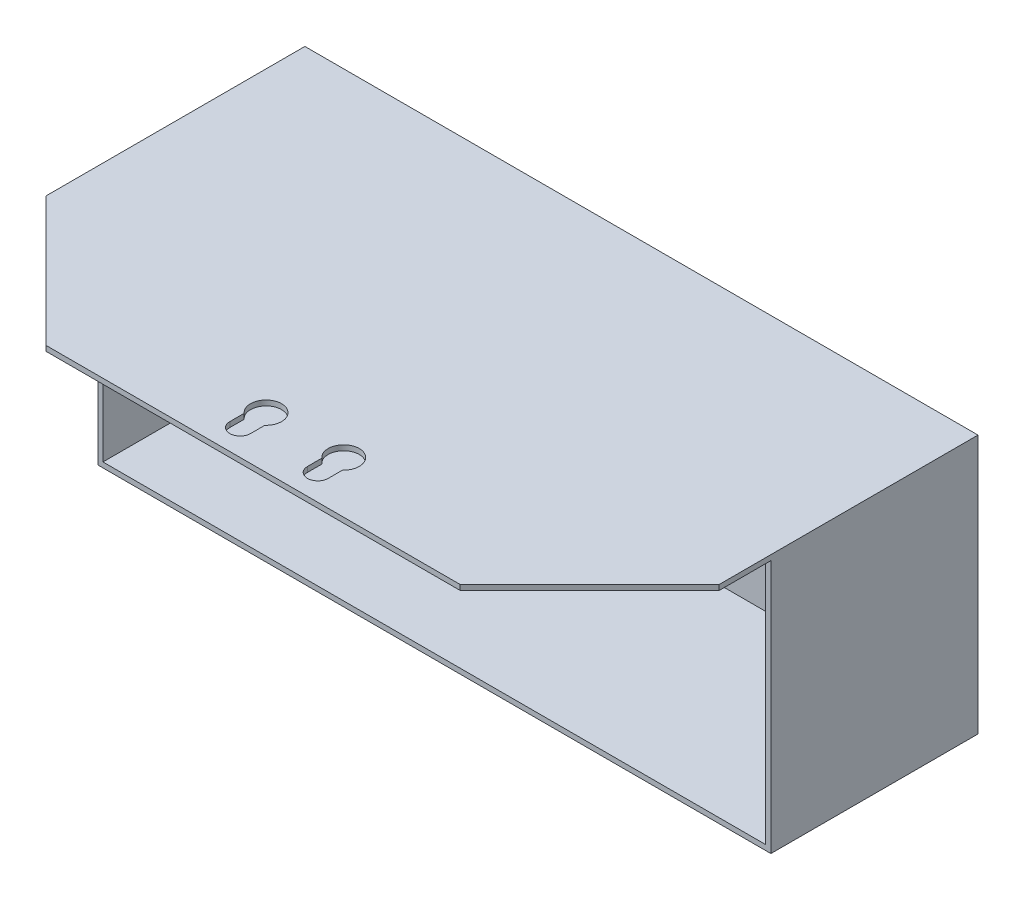
ISO-10303-21;
HEADER;
FILE_DESCRIPTION(('STEP AP214'),'2;1');
FILE_NAME('part.step','',(''),(''),'','','');
FILE_SCHEMA(('AUTOMOTIVE_DESIGN { 1 0 10303 214 1 1 1 1 }'));
ENDSEC;
DATA;
#1=APPLICATION_CONTEXT('core data for automotive mechanical design processes');
#2=APPLICATION_PROTOCOL_DEFINITION('international standard','automotive_design',2000,#1);
#3=PRODUCT_CONTEXT('',#1,'mechanical');
#4=PRODUCT('Part','Part','',(#3));
#5=PRODUCT_RELATED_PRODUCT_CATEGORY('part','',(#4));
#6=PRODUCT_DEFINITION_FORMATION('','',#4);
#7=PRODUCT_DEFINITION_CONTEXT('part definition',#1,'design');
#8=PRODUCT_DEFINITION('design','',#6,#7);
#9=PRODUCT_DEFINITION_SHAPE('','',#8);
#10=(LENGTH_UNIT() NAMED_UNIT(*) SI_UNIT(.MILLI.,.METRE.));
#11=(NAMED_UNIT(*) PLANE_ANGLE_UNIT() SI_UNIT($,.RADIAN.));
#12=(NAMED_UNIT(*) SI_UNIT($,.STERADIAN.) SOLID_ANGLE_UNIT());
#13=UNCERTAINTY_MEASURE_WITH_UNIT(LENGTH_MEASURE(1.E-05),#10,'distance_accuracy_value','');
#14=(GEOMETRIC_REPRESENTATION_CONTEXT(3) GLOBAL_UNCERTAINTY_ASSIGNED_CONTEXT((#13)) GLOBAL_UNIT_ASSIGNED_CONTEXT((#10,
#11,#12)) REPRESENTATION_CONTEXT('',''));
#15=CARTESIAN_POINT('',(0.,0.,0.));
#16=DIRECTION('',(0.,0.,1.));
#17=DIRECTION('',(1.,0.,0.));
#18=AXIS2_PLACEMENT_3D('',#15,#16,#17);
#19=CARTESIAN_POINT('',(0.,100.,79.9999999999999));
#20=DIRECTION('',(0.,0.,-0.999999999999999));
#21=DIRECTION('',(-1.,0.,0.));
#22=AXIS2_PLACEMENT_3D('',#19,#20,#21);
#23=PLANE('',#22);
#24=DIRECTION('',(0.,1.,0.));
#25=VECTOR('',#24,1.);
#26=CARTESIAN_POINT('',(260.,0.,79.9999999999999));
#27=LINE('',#26,#25);
#28=CARTESIAN_POINT('',(260.,0.,79.9999999999999));
#29=VERTEX_POINT('',#28);
#30=CARTESIAN_POINT('',(260.,97.9999999999999,79.9999999999999));
#31=VERTEX_POINT('',#30);
#32=EDGE_CURVE('E270',#29,#31,#27,.T.);
#33=ORIENTED_EDGE('',*,*,#32,.T.);
#34=DIRECTION('',(-1.,0.,0.));
#35=VECTOR('',#34,1.);
#36=CARTESIAN_POINT('',(0.,98.0000000000001,79.9999999999999));
#37=LINE('',#36,#35);
#38=CARTESIAN_POINT('',(258.,97.9999999999999,80.));
#39=VERTEX_POINT('',#38);
#40=EDGE_CURVE('E260',#31,#39,#37,.T.);
#41=ORIENTED_EDGE('',*,*,#40,.T.);
#42=DIRECTION('',(0.,1.,0.));
#43=VECTOR('',#42,1.);
#44=CARTESIAN_POINT('',(258.,100.,80.));
#45=LINE('',#44,#43);
#46=CARTESIAN_POINT('',(258.,2.,79.9999999999999));
#47=VERTEX_POINT('',#46);
#48=EDGE_CURVE('E282',#47,#39,#45,.T.);
#49=ORIENTED_EDGE('',*,*,#48,.F.);
#50=DIRECTION('',(1.,0.,0.));
#51=VECTOR('',#50,1.);
#52=CARTESIAN_POINT('',(0.,2.,79.9999999999999));
#53=LINE('',#52,#51);
#54=CARTESIAN_POINT('',(2.,2.,79.9999999999999));
#55=VERTEX_POINT('',#54);
#56=EDGE_CURVE('E287',#55,#47,#53,.T.);
#57=ORIENTED_EDGE('',*,*,#56,.F.);
#58=DIRECTION('',(0.,-1.,0.));
#59=VECTOR('',#58,1.);
#60=CARTESIAN_POINT('',(2.,100.,79.9999999999999));
#61=LINE('',#60,#59);
#62=CARTESIAN_POINT('',(2.,98.0000000000001,79.9999999999999));
#63=VERTEX_POINT('',#62);
#64=EDGE_CURVE('E285',#63,#55,#61,.T.);
#65=ORIENTED_EDGE('',*,*,#64,.F.);
#66=CARTESIAN_POINT('',(0.,98.0000000000001,79.9999999999999));
#67=VERTEX_POINT('',#66);
#68=EDGE_CURVE('E264',#63,#67,#37,.T.);
#69=ORIENTED_EDGE('',*,*,#68,.T.);
#70=DIRECTION('',(0.,-1.,0.));
#71=VECTOR('',#70,1.);
#72=CARTESIAN_POINT('',(0.,0.,79.9999999999999));
#73=LINE('',#72,#71);
#74=CARTESIAN_POINT('',(0.,0.,79.9999999999999));
#75=VERTEX_POINT('',#74);
#76=EDGE_CURVE('E340',#67,#75,#73,.T.);
#77=ORIENTED_EDGE('',*,*,#76,.T.);
#78=DIRECTION('',(1.,0.,0.));
#79=VECTOR('',#78,1.);
#80=CARTESIAN_POINT('',(0.,0.,79.9999999999999));
#81=LINE('',#80,#79);
#82=EDGE_CURVE('E342',#75,#29,#81,.T.);
#83=ORIENTED_EDGE('',*,*,#82,.T.);
#84=EDGE_LOOP('',(#33,#41,#49,#57,#65,#69,#77,#83));
#85=FACE_BOUND('',#84,.T.);
#86=ADVANCED_FACE('F36',(#85),#23,.F.);
#87=CARTESIAN_POINT('',(0.,0.,79.9999999999999));
#88=DIRECTION('',(1.,0.,0.));
#89=DIRECTION('',(0.,0.,-0.999999999999999));
#90=AXIS2_PLACEMENT_3D('',#87,#88,#89);
#91=PLANE('',#90);
#92=DIRECTION('',(0.,0.,0.999999999999999));
#93=VECTOR('',#92,1.);
#94=CARTESIAN_POINT('',(0.,98.0000000000001,79.9999999999999));
#95=LINE('',#94,#93);
#96=CARTESIAN_POINT('',(0.,98.0000000000001,99.9999999999999));
#97=VERTEX_POINT('',#96);
#98=EDGE_CURVE('E273',#67,#97,#95,.T.);
#99=ORIENTED_EDGE('',*,*,#98,.T.);
#100=DIRECTION('',(0.,1.,0.));
#101=VECTOR('',#100,1.);
#102=CARTESIAN_POINT('',(0.,100.,99.9999999999999));
#103=LINE('',#102,#101);
#104=CARTESIAN_POINT('',(0.,100.,99.9999999999999));
#105=VERTEX_POINT('',#104);
#106=EDGE_CURVE('E11',#97,#105,#103,.T.);
#107=ORIENTED_EDGE('',*,*,#106,.T.);
#108=DIRECTION('',(0.,0.,-0.999999999999999));
#109=VECTOR('',#108,1.);
#110=CARTESIAN_POINT('',(0.,100.,79.9999999999999));
#111=LINE('',#110,#109);
#112=CARTESIAN_POINT('',(0.,100.,0.));
#113=VERTEX_POINT('',#112);
#114=EDGE_CURVE('E333',#105,#113,#111,.T.);
#115=ORIENTED_EDGE('',*,*,#114,.T.);
#116=DIRECTION('',(0.,-1.,0.));
#117=VECTOR('',#116,1.);
#118=CARTESIAN_POINT('',(0.,0.,0.));
#119=LINE('',#118,#117);
#120=CARTESIAN_POINT('',(0.,0.,0.));
#121=VERTEX_POINT('',#120);
#122=EDGE_CURVE('E350',#113,#121,#119,.T.);
#123=ORIENTED_EDGE('',*,*,#122,.T.);
#124=DIRECTION('',(0.,0.,-0.999999999999999));
#125=VECTOR('',#124,1.);
#126=CARTESIAN_POINT('',(0.,0.,79.9999999999999));
#127=LINE('',#126,#125);
#128=EDGE_CURVE('E269',#75,#121,#127,.T.);
#129=ORIENTED_EDGE('',*,*,#128,.F.);
#130=ORIENTED_EDGE('',*,*,#76,.F.);
#131=EDGE_LOOP('',(#99,#107,#115,#123,#129,#130));
#132=FACE_BOUND('',#131,.T.);
#133=ADVANCED_FACE('F361',(#132),#91,.F.);
#134=CARTESIAN_POINT('',(0.,0.,79.9999999999999));
#135=DIRECTION('',(0.,1.,0.));
#136=DIRECTION('',(0.,0.,0.999999999999999));
#137=AXIS2_PLACEMENT_3D('',#134,#135,#136);
#138=PLANE('',#137);
#139=DIRECTION('',(1.,0.,0.));
#140=VECTOR('',#139,1.);
#141=CARTESIAN_POINT('',(0.,0.,0.));
#142=LINE('',#141,#140);
#143=CARTESIAN_POINT('',(260.,0.,0.));
#144=VERTEX_POINT('',#143);
#145=EDGE_CURVE('E353',#121,#144,#142,.T.);
#146=ORIENTED_EDGE('',*,*,#145,.T.);
#147=DIRECTION('',(0.,0.,-0.999999999999999));
#148=VECTOR('',#147,1.);
#149=CARTESIAN_POINT('',(260.,0.,79.9999999999999));
#150=LINE('',#149,#148);
#151=EDGE_CURVE('E332',#29,#144,#150,.T.);
#152=ORIENTED_EDGE('',*,*,#151,.F.);
#153=ORIENTED_EDGE('',*,*,#82,.F.);
#154=ORIENTED_EDGE('',*,*,#128,.T.);
#155=EDGE_LOOP('',(#146,#152,#153,#154));
#156=FACE_BOUND('',#155,.T.);
#157=ADVANCED_FACE('F375',(#156),#138,.F.);
#158=CARTESIAN_POINT('',(260.,0.,79.9999999999999));
#159=DIRECTION('',(-1.,0.,0.));
#160=DIRECTION('',(0.,0.,0.999999999999999));
#161=AXIS2_PLACEMENT_3D('',#158,#159,#160);
#162=PLANE('',#161);
#163=DIRECTION('',(0.,0.,-0.999999999999999));
#164=VECTOR('',#163,1.);
#165=CARTESIAN_POINT('',(260.,100.,79.9999999999999));
#166=LINE('',#165,#164);
#167=CARTESIAN_POINT('',(260.,100.,99.9999999999997));
#168=VERTEX_POINT('',#167);
#169=CARTESIAN_POINT('',(260.,100.,0.));
#170=VERTEX_POINT('',#169);
#171=EDGE_CURVE('E325',#168,#170,#166,.T.);
#172=ORIENTED_EDGE('',*,*,#171,.F.);
#173=DIRECTION('',(0.,-1.,0.));
#174=VECTOR('',#173,1.);
#175=CARTESIAN_POINT('',(260.,97.9999999999999,99.9999999999997));
#176=LINE('',#175,#174);
#177=CARTESIAN_POINT('',(260.,97.9999999999999,99.9999999999996));
#178=VERTEX_POINT('',#177);
#179=EDGE_CURVE('E59',#168,#178,#176,.T.);
#180=ORIENTED_EDGE('',*,*,#179,.T.);
#181=DIRECTION('',(0.,0.,-0.999999999999999));
#182=VECTOR('',#181,1.);
#183=CARTESIAN_POINT('',(260.,97.9999999999999,79.9999999999999));
#184=LINE('',#183,#182);
#185=EDGE_CURVE('E257',#178,#31,#184,.T.);
#186=ORIENTED_EDGE('',*,*,#185,.T.);
#187=ORIENTED_EDGE('',*,*,#32,.F.);
#188=ORIENTED_EDGE('',*,*,#151,.T.);
#189=DIRECTION('',(0.,1.,0.));
#190=VECTOR('',#189,1.);
#191=CARTESIAN_POINT('',(260.,0.,0.));
#192=LINE('',#191,#190);
#193=EDGE_CURVE('E330',#144,#170,#192,.T.);
#194=ORIENTED_EDGE('',*,*,#193,.T.);
#195=EDGE_LOOP('',(#172,#180,#186,#187,#188,#194));
#196=FACE_BOUND('',#195,.T.);
#197=ADVANCED_FACE('F327',(#196),#162,.F.);
#198=CARTESIAN_POINT('',(0.,100.,79.9999999999999));
#199=DIRECTION('',(0.,-1.,0.));
#200=DIRECTION('',(0.,0.,-0.999999999999999));
#201=AXIS2_PLACEMENT_3D('',#198,#199,#200);
#202=PLANE('',#201);
#203=DIRECTION('',(0.,0.,0.999999999999999));
#204=VECTOR('',#203,1.);
#205=CARTESIAN_POINT('',(149.,100.,80.));
#206=LINE('',#205,#204);
#207=CARTESIAN_POINT('',(149.,100.,134.472135954999));
#208=VERTEX_POINT('',#207);
#209=CARTESIAN_POINT('',(149.,100.,140.));
#210=VERTEX_POINT('',#209);
#211=EDGE_CURVE('E213',#208,#210,#206,.T.);
#212=ORIENTED_EDGE('',*,*,#211,.T.);
#213=CARTESIAN_POINT('',(145.,100.,140.));
#214=DIRECTION('',(0.,-1.,0.));
#215=DIRECTION('',(0.,0.,-0.999999999999999));
#216=AXIS2_PLACEMENT_3D('',#213,#214,#215);
#217=CIRCLE('',#216,4.);
#218=CARTESIAN_POINT('',(141.,100.,140.));
#219=VERTEX_POINT('',#218);
#220=EDGE_CURVE('E216',#210,#219,#217,.T.);
#221=ORIENTED_EDGE('',*,*,#220,.T.);
#222=DIRECTION('',(0.,0.,-0.999999999999999));
#223=VECTOR('',#222,1.);
#224=CARTESIAN_POINT('',(141.,100.,79.9999999999999));
#225=LINE('',#224,#223);
#226=CARTESIAN_POINT('',(141.,100.,134.472135954999));
#227=VERTEX_POINT('',#226);
#228=EDGE_CURVE('E208',#219,#227,#225,.T.);
#229=ORIENTED_EDGE('',*,*,#228,.T.);
#230=CARTESIAN_POINT('',(145.,100.,130.));
#231=DIRECTION('',(0.,-1.,0.));
#232=DIRECTION('',(0.,0.,-0.999999999999999));
#233=AXIS2_PLACEMENT_3D('',#230,#231,#232);
#234=CIRCLE('',#233,5.99999999999999);
#235=EDGE_CURVE('E183',#227,#208,#234,.T.);
#236=ORIENTED_EDGE('',*,*,#235,.T.);
#237=EDGE_LOOP('',(#212,#221,#229,#236));
#238=FACE_BOUND('',#237,.T.);
#239=DIRECTION('',(0.,0.,0.999999999999999));
#240=VECTOR('',#239,1.);
#241=CARTESIAN_POINT('',(119.,100.,80.));
#242=LINE('',#241,#240);
#243=CARTESIAN_POINT('',(119.,100.,134.472135954999));
#244=VERTEX_POINT('',#243);
#245=CARTESIAN_POINT('',(119.,100.,140.));
#246=VERTEX_POINT('',#245);
#247=EDGE_CURVE('E245',#244,#246,#242,.T.);
#248=ORIENTED_EDGE('',*,*,#247,.T.);
#249=CARTESIAN_POINT('',(115.,100.,140.));
#250=DIRECTION('',(0.,-1.,0.));
#251=DIRECTION('',(0.,0.,-0.999999999999999));
#252=AXIS2_PLACEMENT_3D('',#249,#250,#251);
#253=CIRCLE('',#252,4.);
#254=CARTESIAN_POINT('',(111.,100.,140.));
#255=VERTEX_POINT('',#254);
#256=EDGE_CURVE('E248',#246,#255,#253,.T.);
#257=ORIENTED_EDGE('',*,*,#256,.T.);
#258=DIRECTION('',(0.,0.,-0.999999999999999));
#259=VECTOR('',#258,1.);
#260=CARTESIAN_POINT('',(111.,100.,80.0000000000002));
#261=LINE('',#260,#259);
#262=CARTESIAN_POINT('',(111.,100.,134.472135954999));
#263=VERTEX_POINT('',#262);
#264=EDGE_CURVE('E233',#255,#263,#261,.T.);
#265=ORIENTED_EDGE('',*,*,#264,.T.);
#266=CARTESIAN_POINT('',(115.,100.,130.));
#267=DIRECTION('',(0.,-1.,0.));
#268=DIRECTION('',(0.,0.,-0.999999999999999));
#269=AXIS2_PLACEMENT_3D('',#266,#267,#268);
#270=CIRCLE('',#269,5.99999999999999);
#271=EDGE_CURVE('E242',#263,#244,#270,.T.);
#272=ORIENTED_EDGE('',*,*,#271,.T.);
#273=EDGE_LOOP('',(#248,#257,#265,#272));
#274=FACE_BOUND('',#273,.T.);
#275=DIRECTION('',(1.,0.,0.));
#276=VECTOR('',#275,1.);
#277=CARTESIAN_POINT('',(0.,100.,150.));
#278=LINE('',#277,#276);
#279=CARTESIAN_POINT('',(50.0000000000003,100.,150.));
#280=VERTEX_POINT('',#279);
#281=CARTESIAN_POINT('',(210.,100.,150.));
#282=VERTEX_POINT('',#281);
#283=EDGE_CURVE('E251',#280,#282,#278,.T.);
#284=ORIENTED_EDGE('',*,*,#283,.T.);
#285=DIRECTION('',(0.707106781186546,0.,-0.707106781186548));
#286=VECTOR('',#285,1.);
#287=CARTESIAN_POINT('',(210.,100.,150.));
#288=LINE('',#287,#286);
#289=EDGE_CURVE('E306',#282,#168,#288,.T.);
#290=ORIENTED_EDGE('',*,*,#289,.T.);
#291=ORIENTED_EDGE('',*,*,#171,.T.);
#292=DIRECTION('',(-1.,0.,0.));
#293=VECTOR('',#292,1.);
#294=CARTESIAN_POINT('',(0.,100.,0.));
#295=LINE('',#294,#293);
#296=EDGE_CURVE('E343',#170,#113,#295,.T.);
#297=ORIENTED_EDGE('',*,*,#296,.T.);
#298=ORIENTED_EDGE('',*,*,#114,.F.);
#299=DIRECTION('',(0.707106781186549,0.,0.707106781186546));
#300=VECTOR('',#299,1.);
#301=CARTESIAN_POINT('',(0.,100.,99.9999999999999));
#302=LINE('',#301,#300);
#303=EDGE_CURVE('E320',#105,#280,#302,.T.);
#304=ORIENTED_EDGE('',*,*,#303,.T.);
#305=EDGE_LOOP('',(#284,#290,#291,#297,#298,#304));
#306=FACE_BOUND('',#305,.T.);
#307=ADVANCED_FACE('F323',(#238,#274,#306),#202,.F.);
#308=CARTESIAN_POINT('',(0.,100.,0.));
#309=DIRECTION('',(0.,0.,-0.999999999999999));
#310=DIRECTION('',(-1.,0.,0.));
#311=AXIS2_PLACEMENT_3D('',#308,#309,#310);
#312=PLANE('',#311);
#313=ORIENTED_EDGE('',*,*,#122,.F.);
#314=ORIENTED_EDGE('',*,*,#296,.F.);
#315=ORIENTED_EDGE('',*,*,#193,.F.);
#316=ORIENTED_EDGE('',*,*,#145,.F.);
#317=EDGE_LOOP('',(#313,#314,#315,#316));
#318=FACE_BOUND('',#317,.T.);
#319=ADVANCED_FACE('F358',(#318),#312,.T.);
#320=CARTESIAN_POINT('',(2.,0.,79.9999999999999));
#321=DIRECTION('',(1.,0.,0.));
#322=DIRECTION('',(0.,0.,-0.999999999999999));
#323=AXIS2_PLACEMENT_3D('',#320,#321,#322);
#324=PLANE('',#323);
#325=DIRECTION('',(0.,-1.,0.));
#326=VECTOR('',#325,1.);
#327=CARTESIAN_POINT('',(2.,100.,2.));
#328=LINE('',#327,#326);
#329=CARTESIAN_POINT('',(2.,98.0000000000001,2.));
#330=VERTEX_POINT('',#329);
#331=CARTESIAN_POINT('',(2.,2.,2.));
#332=VERTEX_POINT('',#331);
#333=EDGE_CURVE('E275',#330,#332,#328,.T.);
#334=ORIENTED_EDGE('',*,*,#333,.F.);
#335=DIRECTION('',(0.,0.,-0.999999999999999));
#336=VECTOR('',#335,1.);
#337=CARTESIAN_POINT('',(2.,98.0000000000001,79.9999999999999));
#338=LINE('',#337,#336);
#339=EDGE_CURVE('E278',#63,#330,#338,.T.);
#340=ORIENTED_EDGE('',*,*,#339,.F.);
#341=ORIENTED_EDGE('',*,*,#64,.T.);
#342=DIRECTION('',(0.,0.,-0.999999999999999));
#343=VECTOR('',#342,1.);
#344=CARTESIAN_POINT('',(2.,2.,79.9999999999999));
#345=LINE('',#344,#343);
#346=EDGE_CURVE('E354',#55,#332,#345,.T.);
#347=ORIENTED_EDGE('',*,*,#346,.T.);
#348=EDGE_LOOP('',(#334,#340,#341,#347));
#349=FACE_BOUND('',#348,.T.);
#350=ADVANCED_FACE('F384',(#349),#324,.T.);
#351=CARTESIAN_POINT('',(0.,2.,79.9999999999999));
#352=DIRECTION('',(0.,1.,0.));
#353=DIRECTION('',(0.,0.,0.999999999999999));
#354=AXIS2_PLACEMENT_3D('',#351,#352,#353);
#355=PLANE('',#354);
#356=DIRECTION('',(1.,0.,0.));
#357=VECTOR('',#356,1.);
#358=CARTESIAN_POINT('',(0.,2.,2.));
#359=LINE('',#358,#357);
#360=CARTESIAN_POINT('',(258.,2.,2.00000000000001));
#361=VERTEX_POINT('',#360);
#362=EDGE_CURVE('E409',#332,#361,#359,.T.);
#363=ORIENTED_EDGE('',*,*,#362,.F.);
#364=ORIENTED_EDGE('',*,*,#346,.F.);
#365=ORIENTED_EDGE('',*,*,#56,.T.);
#366=DIRECTION('',(0.,0.,-0.999999999999999));
#367=VECTOR('',#366,1.);
#368=CARTESIAN_POINT('',(258.,2.,79.9999999999999));
#369=LINE('',#368,#367);
#370=EDGE_CURVE('E293',#47,#361,#369,.T.);
#371=ORIENTED_EDGE('',*,*,#370,.T.);
#372=EDGE_LOOP('',(#363,#364,#365,#371));
#373=FACE_BOUND('',#372,.T.);
#374=ADVANCED_FACE('F421',(#373),#355,.T.);
#375=CARTESIAN_POINT('',(258.,0.,79.9999999999999));
#376=DIRECTION('',(-1.,0.,0.));
#377=DIRECTION('',(0.,0.,0.999999999999999));
#378=AXIS2_PLACEMENT_3D('',#375,#376,#377);
#379=PLANE('',#378);
#380=DIRECTION('',(0.,1.,0.));
#381=VECTOR('',#380,1.);
#382=CARTESIAN_POINT('',(258.,100.,2.));
#383=LINE('',#382,#381);
#384=CARTESIAN_POINT('',(258.,97.9999999999999,2.));
#385=VERTEX_POINT('',#384);
#386=EDGE_CURVE('E410',#361,#385,#383,.T.);
#387=ORIENTED_EDGE('',*,*,#386,.F.);
#388=ORIENTED_EDGE('',*,*,#370,.F.);
#389=ORIENTED_EDGE('',*,*,#48,.T.);
#390=DIRECTION('',(0.,0.,-0.999999999999999));
#391=VECTOR('',#390,1.);
#392=CARTESIAN_POINT('',(258.,97.9999999999999,80.));
#393=LINE('',#392,#391);
#394=EDGE_CURVE('E281',#39,#385,#393,.T.);
#395=ORIENTED_EDGE('',*,*,#394,.T.);
#396=EDGE_LOOP('',(#387,#388,#389,#395));
#397=FACE_BOUND('',#396,.T.);
#398=ADVANCED_FACE('F419',(#397),#379,.T.);
#399=CARTESIAN_POINT('',(0.,98.0000000000001,79.9999999999999));
#400=DIRECTION('',(0.,-1.,0.));
#401=DIRECTION('',(0.,0.,-0.999999999999999));
#402=AXIS2_PLACEMENT_3D('',#399,#400,#401);
#403=PLANE('',#402);
#404=CARTESIAN_POINT('',(145.,98.0000000000001,140.));
#405=DIRECTION('',(0.,-1.,0.));
#406=DIRECTION('',(0.,0.,-0.999999999999999));
#407=AXIS2_PLACEMENT_3D('',#404,#405,#406);
#408=CIRCLE('',#407,4.);
#409=CARTESIAN_POINT('',(149.,98.0000000000001,140.));
#410=VERTEX_POINT('',#409);
#411=CARTESIAN_POINT('',(141.,98.0000000000001,140.));
#412=VERTEX_POINT('',#411);
#413=EDGE_CURVE('E196',#410,#412,#408,.T.);
#414=ORIENTED_EDGE('',*,*,#413,.F.);
#415=DIRECTION('',(0.,0.,0.999999999999999));
#416=VECTOR('',#415,1.);
#417=CARTESIAN_POINT('',(149.,98.0000000000001,140.));
#418=LINE('',#417,#416);
#419=CARTESIAN_POINT('',(149.,98.0000000000001,134.472135954999));
#420=VERTEX_POINT('',#419);
#421=EDGE_CURVE('E201',#420,#410,#418,.T.);
#422=ORIENTED_EDGE('',*,*,#421,.F.);
#423=CARTESIAN_POINT('',(145.,98.0000000000001,130.));
#424=DIRECTION('',(0.,-1.,0.));
#425=DIRECTION('',(0.,0.,-0.999999999999999));
#426=AXIS2_PLACEMENT_3D('',#423,#424,#425);
#427=CIRCLE('',#426,5.99999999999999);
#428=CARTESIAN_POINT('',(141.,98.0000000000001,134.472135954999));
#429=VERTEX_POINT('',#428);
#430=EDGE_CURVE('E180',#429,#420,#427,.T.);
#431=ORIENTED_EDGE('',*,*,#430,.F.);
#432=DIRECTION('',(0.,0.,-0.999999999999999));
#433=VECTOR('',#432,1.);
#434=CARTESIAN_POINT('',(141.,98.0000000000001,140.));
#435=LINE('',#434,#433);
#436=EDGE_CURVE('E191',#412,#429,#435,.T.);
#437=ORIENTED_EDGE('',*,*,#436,.F.);
#438=EDGE_LOOP('',(#414,#422,#431,#437));
#439=FACE_BOUND('',#438,.T.);
#440=CARTESIAN_POINT('',(115.,98.0000000000001,140.));
#441=DIRECTION('',(0.,-1.,0.));
#442=DIRECTION('',(0.,0.,-0.999999999999999));
#443=AXIS2_PLACEMENT_3D('',#440,#441,#442);
#444=CIRCLE('',#443,4.);
#445=CARTESIAN_POINT('',(119.,98.0000000000001,140.));
#446=VERTEX_POINT('',#445);
#447=CARTESIAN_POINT('',(111.,98.0000000000001,140.));
#448=VERTEX_POINT('',#447);
#449=EDGE_CURVE('E219',#446,#448,#444,.T.);
#450=ORIENTED_EDGE('',*,*,#449,.F.);
#451=DIRECTION('',(0.,0.,0.999999999999999));
#452=VECTOR('',#451,1.);
#453=CARTESIAN_POINT('',(119.,98.0000000000001,140.));
#454=LINE('',#453,#452);
#455=CARTESIAN_POINT('',(119.,98.0000000000001,134.472135954999));
#456=VERTEX_POINT('',#455);
#457=EDGE_CURVE('E227',#456,#446,#454,.T.);
#458=ORIENTED_EDGE('',*,*,#457,.F.);
#459=CARTESIAN_POINT('',(115.,98.0000000000001,130.));
#460=DIRECTION('',(0.,-1.,0.));
#461=DIRECTION('',(0.,0.,-0.999999999999999));
#462=AXIS2_PLACEMENT_3D('',#459,#460,#461);
#463=CIRCLE('',#462,5.99999999999999);
#464=CARTESIAN_POINT('',(111.,98.0000000000001,134.472135954999));
#465=VERTEX_POINT('',#464);
#466=EDGE_CURVE('E224',#465,#456,#463,.T.);
#467=ORIENTED_EDGE('',*,*,#466,.F.);
#468=DIRECTION('',(0.,0.,-0.999999999999999));
#469=VECTOR('',#468,1.);
#470=CARTESIAN_POINT('',(111.,98.0000000000001,140.));
#471=LINE('',#470,#469);
#472=EDGE_CURVE('E221',#448,#465,#471,.T.);
#473=ORIENTED_EDGE('',*,*,#472,.F.);
#474=EDGE_LOOP('',(#450,#458,#467,#473));
#475=FACE_BOUND('',#474,.T.);
#476=ORIENTED_EDGE('',*,*,#185,.F.);
#477=DIRECTION('',(-0.707106781186546,0.,0.707106781186548));
#478=VECTOR('',#477,1.);
#479=CARTESIAN_POINT('',(140.,98.0000000000001,220.));
#480=LINE('',#479,#478);
#481=CARTESIAN_POINT('',(210.,97.9999999999999,150.));
#482=VERTEX_POINT('',#481);
#483=EDGE_CURVE('E44',#178,#482,#480,.T.);
#484=ORIENTED_EDGE('',*,*,#483,.T.);
#485=DIRECTION('',(1.,0.,0.));
#486=VECTOR('',#485,1.);
#487=CARTESIAN_POINT('',(0.,98.0000000000001,150.));
#488=LINE('',#487,#486);
#489=CARTESIAN_POINT('',(50.0000000000003,98.0000000000001,150.));
#490=VERTEX_POINT('',#489);
#491=EDGE_CURVE('E254',#490,#482,#488,.T.);
#492=ORIENTED_EDGE('',*,*,#491,.F.);
#493=DIRECTION('',(-0.707106781186549,0.,-0.707106781186546));
#494=VECTOR('',#493,1.);
#495=CARTESIAN_POINT('',(-10.,98.0000000000001,90.));
#496=LINE('',#495,#494);
#497=EDGE_CURVE('E51',#490,#97,#496,.T.);
#498=ORIENTED_EDGE('',*,*,#497,.T.);
#499=ORIENTED_EDGE('',*,*,#98,.F.);
#500=ORIENTED_EDGE('',*,*,#68,.F.);
#501=ORIENTED_EDGE('',*,*,#339,.T.);
#502=DIRECTION('',(-1.,0.,0.));
#503=VECTOR('',#502,1.);
#504=CARTESIAN_POINT('',(0.,98.0000000000001,2.00000000000001));
#505=LINE('',#504,#503);
#506=EDGE_CURVE('E288',#385,#330,#505,.T.);
#507=ORIENTED_EDGE('',*,*,#506,.F.);
#508=ORIENTED_EDGE('',*,*,#394,.F.);
#509=ORIENTED_EDGE('',*,*,#40,.F.);
#510=EDGE_LOOP('',(#476,#484,#492,#498,#499,#500,#501,#507,#508,#509));
#511=FACE_BOUND('',#510,.T.);
#512=ADVANCED_FACE('F198',(#439,#475,#511),#403,.T.);
#513=CARTESIAN_POINT('',(0.,100.,2.00000000000001));
#514=DIRECTION('',(0.,0.,-0.999999999999999));
#515=DIRECTION('',(-1.,0.,0.));
#516=AXIS2_PLACEMENT_3D('',#513,#514,#515);
#517=PLANE('',#516);
#518=ORIENTED_EDGE('',*,*,#333,.T.);
#519=ORIENTED_EDGE('',*,*,#362,.T.);
#520=ORIENTED_EDGE('',*,*,#386,.T.);
#521=ORIENTED_EDGE('',*,*,#506,.T.);
#522=EDGE_LOOP('',(#518,#519,#520,#521));
#523=FACE_BOUND('',#522,.T.);
#524=ADVANCED_FACE('F380',(#523),#517,.F.);
#525=CARTESIAN_POINT('',(3.33066907387547E-13,-171.258240356726,150.));
#526=DIRECTION('',(0.,0.,0.999999999999999));
#527=DIRECTION('',(1.,0.,0.));
#528=AXIS2_PLACEMENT_3D('',#525,#526,#527);
#529=PLANE('',#528);
#530=ORIENTED_EDGE('',*,*,#491,.T.);
#531=DIRECTION('',(0.,1.,0.));
#532=VECTOR('',#531,1.);
#533=CARTESIAN_POINT('',(210.,100.,150.));
#534=LINE('',#533,#532);
#535=EDGE_CURVE('E317',#482,#282,#534,.T.);
#536=ORIENTED_EDGE('',*,*,#535,.T.);
#537=ORIENTED_EDGE('',*,*,#283,.F.);
#538=DIRECTION('',(0.,-1.,0.));
#539=VECTOR('',#538,1.);
#540=CARTESIAN_POINT('',(50.0000000000003,98.0000000000001,150.));
#541=LINE('',#540,#539);
#542=EDGE_CURVE('E268',#280,#490,#541,.T.);
#543=ORIENTED_EDGE('',*,*,#542,.T.);
#544=EDGE_LOOP('',(#530,#536,#537,#543));
#545=FACE_BOUND('',#544,.T.);
#546=ADVANCED_FACE('F315',(#545),#529,.T.);
#547=CARTESIAN_POINT('',(115.,108.,140.));
#548=DIRECTION('',(0.,-1.,0.));
#549=DIRECTION('',(0.,0.,-0.999999999999999));
#550=AXIS2_PLACEMENT_3D('',#547,#548,#549);
#551=CYLINDRICAL_SURFACE('',#550,4.);
#552=DIRECTION('',(0.,-1.,0.));
#553=VECTOR('',#552,1.);
#554=CARTESIAN_POINT('',(119.,108.,140.));
#555=LINE('',#554,#553);
#556=EDGE_CURVE('E231',#246,#446,#555,.T.);
#557=ORIENTED_EDGE('',*,*,#556,.T.);
#558=ORIENTED_EDGE('',*,*,#449,.T.);
#559=DIRECTION('',(0.,-1.,0.));
#560=VECTOR('',#559,1.);
#561=CARTESIAN_POINT('',(111.,108.,140.));
#562=LINE('',#561,#560);
#563=EDGE_CURVE('E230',#255,#448,#562,.T.);
#564=ORIENTED_EDGE('',*,*,#563,.F.);
#565=ORIENTED_EDGE('',*,*,#256,.F.);
#566=EDGE_LOOP('',(#557,#558,#564,#565));
#567=FACE_BOUND('',#566,.T.);
#568=ADVANCED_FACE('F438',(#567),#551,.F.);
#569=CARTESIAN_POINT('',(119.,108.,140.));
#570=DIRECTION('',(1.,0.,0.));
#571=DIRECTION('',(0.,0.,-0.999999999999999));
#572=AXIS2_PLACEMENT_3D('',#569,#570,#571);
#573=PLANE('',#572);
#574=DIRECTION('',(0.,-1.,0.));
#575=VECTOR('',#574,1.);
#576=CARTESIAN_POINT('',(119.,108.,134.472135954999));
#577=LINE('',#576,#575);
#578=EDGE_CURVE('E234',#244,#456,#577,.T.);
#579=ORIENTED_EDGE('',*,*,#578,.T.);
#580=ORIENTED_EDGE('',*,*,#457,.T.);
#581=ORIENTED_EDGE('',*,*,#556,.F.);
#582=ORIENTED_EDGE('',*,*,#247,.F.);
#583=EDGE_LOOP('',(#579,#580,#581,#582));
#584=FACE_BOUND('',#583,.T.);
#585=ADVANCED_FACE('F442',(#584),#573,.F.);
#586=CARTESIAN_POINT('',(115.,108.,130.));
#587=DIRECTION('',(0.,-1.,0.));
#588=DIRECTION('',(0.,0.,-0.999999999999999));
#589=AXIS2_PLACEMENT_3D('',#586,#587,#588);
#590=CYLINDRICAL_SURFACE('',#589,5.99999999999999);
#591=DIRECTION('',(0.,-1.,0.));
#592=VECTOR('',#591,1.);
#593=CARTESIAN_POINT('',(111.,108.,134.472135954999));
#594=LINE('',#593,#592);
#595=EDGE_CURVE('E236',#263,#465,#594,.T.);
#596=ORIENTED_EDGE('',*,*,#595,.T.);
#597=ORIENTED_EDGE('',*,*,#466,.T.);
#598=ORIENTED_EDGE('',*,*,#578,.F.);
#599=ORIENTED_EDGE('',*,*,#271,.F.);
#600=EDGE_LOOP('',(#596,#597,#598,#599));
#601=FACE_BOUND('',#600,.T.);
#602=ADVANCED_FACE('F450',(#601),#590,.F.);
#603=CARTESIAN_POINT('',(111.,108.,140.));
#604=DIRECTION('',(-1.,0.,0.));
#605=DIRECTION('',(0.,0.,0.999999999999999));
#606=AXIS2_PLACEMENT_3D('',#603,#604,#605);
#607=PLANE('',#606);
#608=ORIENTED_EDGE('',*,*,#563,.T.);
#609=ORIENTED_EDGE('',*,*,#472,.T.);
#610=ORIENTED_EDGE('',*,*,#595,.F.);
#611=ORIENTED_EDGE('',*,*,#264,.F.);
#612=EDGE_LOOP('',(#608,#609,#610,#611));
#613=FACE_BOUND('',#612,.T.);
#614=ADVANCED_FACE('F446',(#613),#607,.F.);
#615=CARTESIAN_POINT('',(145.,108.,140.));
#616=DIRECTION('',(0.,-1.,0.));
#617=DIRECTION('',(0.,0.,-0.999999999999999));
#618=AXIS2_PLACEMENT_3D('',#615,#616,#617);
#619=CYLINDRICAL_SURFACE('',#618,4.);
#620=DIRECTION('',(0.,-1.,0.));
#621=VECTOR('',#620,1.);
#622=CARTESIAN_POINT('',(149.,108.,140.));
#623=LINE('',#622,#621);
#624=EDGE_CURVE('E206',#210,#410,#623,.T.);
#625=ORIENTED_EDGE('',*,*,#624,.T.);
#626=ORIENTED_EDGE('',*,*,#413,.T.);
#627=DIRECTION('',(0.,-1.,0.));
#628=VECTOR('',#627,1.);
#629=CARTESIAN_POINT('',(141.,108.,140.));
#630=LINE('',#629,#628);
#631=EDGE_CURVE('E187',#219,#412,#630,.T.);
#632=ORIENTED_EDGE('',*,*,#631,.F.);
#633=ORIENTED_EDGE('',*,*,#220,.F.);
#634=EDGE_LOOP('',(#625,#626,#632,#633));
#635=FACE_BOUND('',#634,.T.);
#636=ADVANCED_FACE('F449',(#635),#619,.F.);
#637=CARTESIAN_POINT('',(149.,108.,140.));
#638=DIRECTION('',(1.,0.,0.));
#639=DIRECTION('',(0.,0.,-0.999999999999999));
#640=AXIS2_PLACEMENT_3D('',#637,#638,#639);
#641=PLANE('',#640);
#642=DIRECTION('',(0.,-1.,0.));
#643=VECTOR('',#642,1.);
#644=CARTESIAN_POINT('',(149.,108.,134.472135954999));
#645=LINE('',#644,#643);
#646=EDGE_CURVE('E186',#208,#420,#645,.T.);
#647=ORIENTED_EDGE('',*,*,#646,.T.);
#648=ORIENTED_EDGE('',*,*,#421,.T.);
#649=ORIENTED_EDGE('',*,*,#624,.F.);
#650=ORIENTED_EDGE('',*,*,#211,.F.);
#651=EDGE_LOOP('',(#647,#648,#649,#650));
#652=FACE_BOUND('',#651,.T.);
#653=ADVANCED_FACE('F460',(#652),#641,.F.);
#654=CARTESIAN_POINT('',(145.,108.,130.));
#655=DIRECTION('',(0.,-1.,0.));
#656=DIRECTION('',(0.,0.,-0.999999999999999));
#657=AXIS2_PLACEMENT_3D('',#654,#655,#656);
#658=CYLINDRICAL_SURFACE('',#657,5.99999999999999);
#659=DIRECTION('',(0.,-1.,0.));
#660=VECTOR('',#659,1.);
#661=CARTESIAN_POINT('',(141.,108.,134.472135954999));
#662=LINE('',#661,#660);
#663=EDGE_CURVE('E175',#227,#429,#662,.T.);
#664=ORIENTED_EDGE('',*,*,#663,.T.);
#665=ORIENTED_EDGE('',*,*,#430,.T.);
#666=ORIENTED_EDGE('',*,*,#646,.F.);
#667=ORIENTED_EDGE('',*,*,#235,.F.);
#668=EDGE_LOOP('',(#664,#665,#666,#667));
#669=FACE_BOUND('',#668,.T.);
#670=ADVANCED_FACE('F177',(#669),#658,.F.);
#671=CARTESIAN_POINT('',(141.,108.,140.));
#672=DIRECTION('',(-1.,0.,0.));
#673=DIRECTION('',(0.,0.,0.999999999999999));
#674=AXIS2_PLACEMENT_3D('',#671,#672,#673);
#675=PLANE('',#674);
#676=ORIENTED_EDGE('',*,*,#631,.T.);
#677=ORIENTED_EDGE('',*,*,#436,.T.);
#678=ORIENTED_EDGE('',*,*,#663,.F.);
#679=ORIENTED_EDGE('',*,*,#228,.F.);
#680=EDGE_LOOP('',(#676,#677,#678,#679));
#681=FACE_BOUND('',#680,.T.);
#682=ADVANCED_FACE('F192',(#681),#675,.F.);
#683=CARTESIAN_POINT('',(210.,-171.258240356726,150.));
#684=DIRECTION('',(0.707106781186549,0.,0.707106781186545));
#685=DIRECTION('',(0.707106781186546,0.,-0.707106781186548));
#686=AXIS2_PLACEMENT_3D('',#683,#684,#685);
#687=PLANE('',#686);
#688=ORIENTED_EDGE('',*,*,#483,.F.);
#689=ORIENTED_EDGE('',*,*,#179,.F.);
#690=ORIENTED_EDGE('',*,*,#289,.F.);
#691=ORIENTED_EDGE('',*,*,#535,.F.);
#692=EDGE_LOOP('',(#688,#689,#690,#691));
#693=FACE_BOUND('',#692,.T.);
#694=ADVANCED_FACE('F319',(#693),#687,.T.);
#695=CARTESIAN_POINT('',(0.,0.,99.9999999999999));
#696=DIRECTION('',(-0.707106781186546,0.,0.707106781186548));
#697=DIRECTION('',(0.707106781186549,0.,0.707106781186546));
#698=AXIS2_PLACEMENT_3D('',#695,#696,#697);
#699=PLANE('',#698);
#700=ORIENTED_EDGE('',*,*,#497,.F.);
#701=ORIENTED_EDGE('',*,*,#542,.F.);
#702=ORIENTED_EDGE('',*,*,#303,.F.);
#703=ORIENTED_EDGE('',*,*,#106,.F.);
#704=EDGE_LOOP('',(#700,#701,#702,#703));
#705=FACE_BOUND('',#704,.T.);
#706=ADVANCED_FACE('F38',(#705),#699,.T.);
#707=CLOSED_SHELL('',(#86,#133,#157,#197,#307,#319,#350,#374,#398,#512,#524,#546,#568,#585,#602,
#614,#636,#653,#670,#682,#694,#706));
#708=MANIFOLD_SOLID_BREP('B2',#707);
#709=ADVANCED_BREP_SHAPE_REPRESENTATION('',(#18,#708),#14);
#710=SHAPE_DEFINITION_REPRESENTATION(#9,#709);
ENDSEC;
END-ISO-10303-21;
